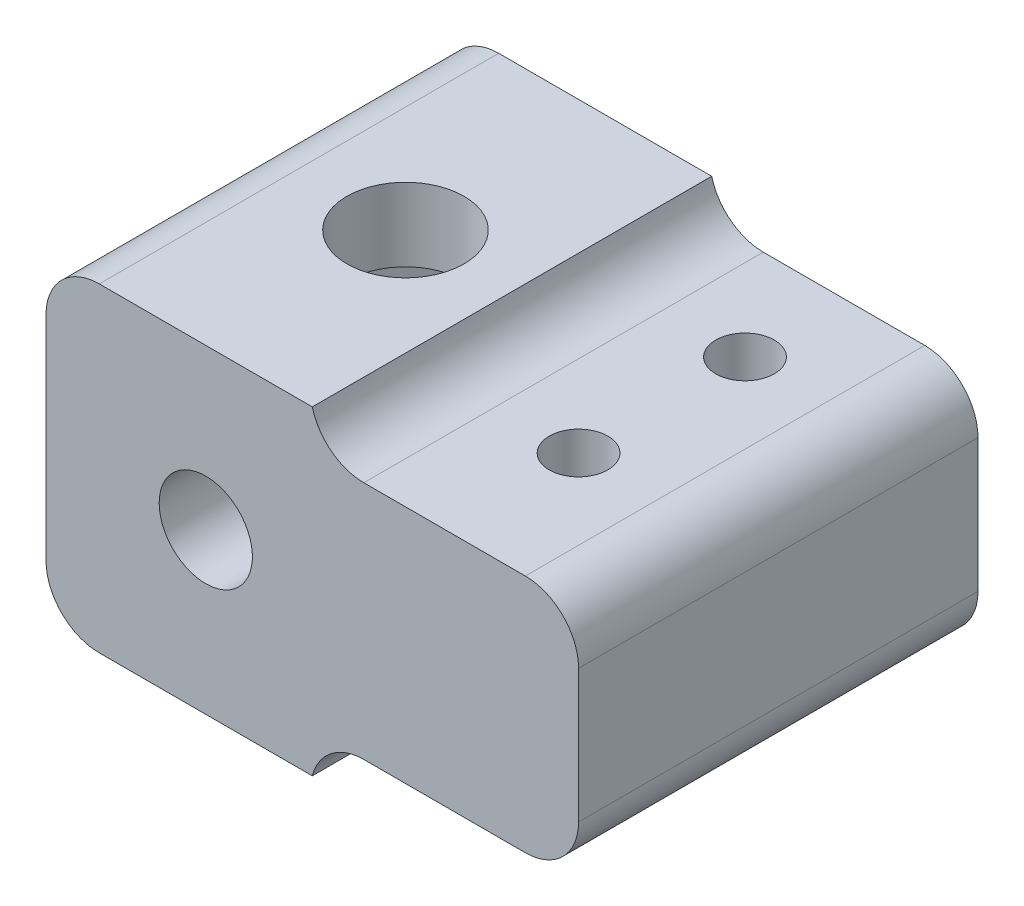
ISO-10303-21;
HEADER;
FILE_DESCRIPTION(('STEP AP214'),'2;1');
FILE_NAME('part.step','',(''),(''),'','','');
FILE_SCHEMA(('AUTOMOTIVE_DESIGN { 1 0 10303 214 1 1 1 1 }'));
ENDSEC;
DATA;
#1=APPLICATION_CONTEXT('core data for automotive mechanical design processes');
#2=APPLICATION_PROTOCOL_DEFINITION('international standard','automotive_design',2000,#1);
#3=PRODUCT_CONTEXT('',#1,'mechanical');
#4=PRODUCT('Part','Part','',(#3));
#5=PRODUCT_RELATED_PRODUCT_CATEGORY('part','',(#4));
#6=PRODUCT_DEFINITION_FORMATION('','',#4);
#7=PRODUCT_DEFINITION_CONTEXT('part definition',#1,'design');
#8=PRODUCT_DEFINITION('design','',#6,#7);
#9=PRODUCT_DEFINITION_SHAPE('','',#8);
#10=(LENGTH_UNIT() NAMED_UNIT(*) SI_UNIT(.MILLI.,.METRE.));
#11=(NAMED_UNIT(*) PLANE_ANGLE_UNIT() SI_UNIT($,.RADIAN.));
#12=(NAMED_UNIT(*) SI_UNIT($,.STERADIAN.) SOLID_ANGLE_UNIT());
#13=UNCERTAINTY_MEASURE_WITH_UNIT(LENGTH_MEASURE(1.E-05),#10,'distance_accuracy_value','');
#14=(GEOMETRIC_REPRESENTATION_CONTEXT(3) GLOBAL_UNCERTAINTY_ASSIGNED_CONTEXT((#13)) GLOBAL_UNIT_ASSIGNED_CONTEXT((#10,
#11,#12)) REPRESENTATION_CONTEXT('',''));
#15=CARTESIAN_POINT('',(0.,0.,0.));
#16=DIRECTION('',(0.,0.,1.));
#17=DIRECTION('',(1.,0.,0.));
#18=AXIS2_PLACEMENT_3D('',#15,#16,#17);
#19=CARTESIAN_POINT('',(-6.,6.,-15.));
#20=DIRECTION('',(0.,-1.,0.));
#21=DIRECTION('',(0.,0.,-1.));
#22=AXIS2_PLACEMENT_3D('',#19,#20,#21);
#23=PLANE('',#22);
#24=CARTESIAN_POINT('',(0.,6.,-7.5));
#25=DIRECTION('',(0.,-1.,0.));
#26=DIRECTION('',(0.,0.,-1.));
#27=AXIS2_PLACEMENT_3D('',#24,#25,#26);
#28=CIRCLE('',#27,2.2);
#29=CARTESIAN_POINT('',(0.,6.,-9.7));
#30=VERTEX_POINT('',#29);
#31=EDGE_CURVE('E181',#30,#30,#28,.T.);
#32=ORIENTED_EDGE('',*,*,#31,.T.);
#33=EDGE_LOOP('',(#32));
#34=FACE_BOUND('',#33,.T.);
#35=DIRECTION('',(0.,0.,-1.));
#36=VECTOR('',#35,1.);
#37=CARTESIAN_POINT('',(4.,6.,-15.));
#38=LINE('',#37,#36);
#39=CARTESIAN_POINT('',(4.,6.,0.));
#40=VERTEX_POINT('',#39);
#41=CARTESIAN_POINT('',(4.,6.,-15.));
#42=VERTEX_POINT('',#41);
#43=EDGE_CURVE('E184',#40,#42,#38,.T.);
#44=ORIENTED_EDGE('',*,*,#43,.T.);
#45=DIRECTION('',(1.,0.,0.));
#46=VECTOR('',#45,1.);
#47=CARTESIAN_POINT('',(-6.,6.,-15.));
#48=LINE('',#47,#46);
#49=CARTESIAN_POINT('',(-4.,6.,-15.));
#50=VERTEX_POINT('',#49);
#51=EDGE_CURVE('E232',#50,#42,#48,.T.);
#52=ORIENTED_EDGE('',*,*,#51,.F.);
#53=DIRECTION('',(0.,0.,1.));
#54=VECTOR('',#53,1.);
#55=CARTESIAN_POINT('',(-4.,6.,-15.));
#56=LINE('',#55,#54);
#57=CARTESIAN_POINT('',(-4.,6.,0.));
#58=VERTEX_POINT('',#57);
#59=EDGE_CURVE('E235',#50,#58,#56,.T.);
#60=ORIENTED_EDGE('',*,*,#59,.T.);
#61=DIRECTION('',(1.,0.,0.));
#62=VECTOR('',#61,1.);
#63=CARTESIAN_POINT('',(-6.,6.,0.));
#64=LINE('',#63,#62);
#65=EDGE_CURVE('E229',#58,#40,#64,.T.);
#66=ORIENTED_EDGE('',*,*,#65,.T.);
#67=EDGE_LOOP('',(#44,#52,#60,#66));
#68=FACE_BOUND('',#67,.T.);
#69=ADVANCED_FACE('F36',(#34,#68),#23,.F.);
#70=CARTESIAN_POINT('',(0.,0.,-15.));
#71=DIRECTION('',(0.,0.,-1.));
#72=DIRECTION('',(-1.,0.,0.));
#73=AXIS2_PLACEMENT_3D('',#70,#71,#72);
#74=PLANE('',#73);
#75=DIRECTION('',(0.,1.,0.));
#76=VECTOR('',#75,1.);
#77=CARTESIAN_POINT('',(14.,-6.,-15.));
#78=LINE('',#77,#76);
#79=CARTESIAN_POINT('',(14.,-2.5,-15.));
#80=VERTEX_POINT('',#79);
#81=CARTESIAN_POINT('',(14.,2.5,-15.));
#82=VERTEX_POINT('',#81);
#83=EDGE_CURVE('E210',#80,#82,#78,.T.);
#84=ORIENTED_EDGE('',*,*,#83,.F.);
#85=CARTESIAN_POINT('',(12.,-2.5,-15.));
#86=DIRECTION('',(0.,0.,-1.));
#87=DIRECTION('',(-1.,0.,0.));
#88=AXIS2_PLACEMENT_3D('',#85,#86,#87);
#89=CIRCLE('',#88,2.);
#90=CARTESIAN_POINT('',(12.,-4.5,-15.));
#91=VERTEX_POINT('',#90);
#92=EDGE_CURVE('E286',#80,#91,#89,.T.);
#93=ORIENTED_EDGE('',*,*,#92,.T.);
#94=DIRECTION('',(1.,0.,0.));
#95=VECTOR('',#94,1.);
#96=CARTESIAN_POINT('',(14.,-4.5,-15.));
#97=LINE('',#96,#95);
#98=CARTESIAN_POINT('',(5.93649167310371,-4.5,-15.));
#99=VERTEX_POINT('',#98);
#100=EDGE_CURVE('E201',#99,#91,#97,.T.);
#101=ORIENTED_EDGE('',*,*,#100,.F.);
#102=CARTESIAN_POINT('',(5.93649167310371,-6.5,-15.));
#103=DIRECTION('',(0.,0.,-1.));
#104=DIRECTION('',(-1.,0.,0.));
#105=AXIS2_PLACEMENT_3D('',#102,#103,#104);
#106=CIRCLE('',#105,2.);
#107=CARTESIAN_POINT('',(4.,-6.,-15.));
#108=VERTEX_POINT('',#107);
#109=EDGE_CURVE('E45',#99,#108,#106,.F.);
#110=ORIENTED_EDGE('',*,*,#109,.T.);
#111=DIRECTION('',(-1.,0.,0.));
#112=VECTOR('',#111,1.);
#113=CARTESIAN_POINT('',(-6.,-6.,-15.));
#114=LINE('',#113,#112);
#115=CARTESIAN_POINT('',(-4.,-6.,-15.));
#116=VERTEX_POINT('',#115);
#117=EDGE_CURVE('E226',#108,#116,#114,.T.);
#118=ORIENTED_EDGE('',*,*,#117,.T.);
#119=CARTESIAN_POINT('',(-4.,-4.,-15.));
#120=DIRECTION('',(0.,0.,-1.));
#121=DIRECTION('',(-1.,0.,0.));
#122=AXIS2_PLACEMENT_3D('',#119,#120,#121);
#123=CIRCLE('',#122,2.);
#124=CARTESIAN_POINT('',(-6.,-4.,-15.));
#125=VERTEX_POINT('',#124);
#126=EDGE_CURVE('E254',#116,#125,#123,.T.);
#127=ORIENTED_EDGE('',*,*,#126,.T.);
#128=DIRECTION('',(0.,1.,0.));
#129=VECTOR('',#128,1.);
#130=CARTESIAN_POINT('',(-6.,-6.,-15.));
#131=LINE('',#130,#129);
#132=CARTESIAN_POINT('',(-6.,4.,-15.));
#133=VERTEX_POINT('',#132);
#134=EDGE_CURVE('E228',#125,#133,#131,.T.);
#135=ORIENTED_EDGE('',*,*,#134,.T.);
#136=CARTESIAN_POINT('',(-4.,4.,-15.));
#137=DIRECTION('',(0.,0.,-1.));
#138=DIRECTION('',(-1.,0.,0.));
#139=AXIS2_PLACEMENT_3D('',#136,#137,#138);
#140=CIRCLE('',#139,2.);
#141=EDGE_CURVE('E256',#133,#50,#140,.T.);
#142=ORIENTED_EDGE('',*,*,#141,.T.);
#143=ORIENTED_EDGE('',*,*,#51,.T.);
#144=CARTESIAN_POINT('',(5.93649167310371,6.5,-15.));
#145=DIRECTION('',(0.,0.,-1.));
#146=DIRECTION('',(-1.,0.,0.));
#147=AXIS2_PLACEMENT_3D('',#144,#145,#146);
#148=CIRCLE('',#147,2.);
#149=CARTESIAN_POINT('',(5.93649167310371,4.5,-15.));
#150=VERTEX_POINT('',#149);
#151=EDGE_CURVE('E288',#42,#150,#148,.F.);
#152=ORIENTED_EDGE('',*,*,#151,.T.);
#153=DIRECTION('',(1.,0.,0.));
#154=VECTOR('',#153,1.);
#155=CARTESIAN_POINT('',(-6.,4.5,-15.));
#156=LINE('',#155,#154);
#157=CARTESIAN_POINT('',(12.,4.5,-15.));
#158=VERTEX_POINT('',#157);
#159=EDGE_CURVE('E188',#150,#158,#156,.T.);
#160=ORIENTED_EDGE('',*,*,#159,.T.);
#161=CARTESIAN_POINT('',(12.,2.5,-15.));
#162=DIRECTION('',(0.,0.,-1.));
#163=DIRECTION('',(-1.,0.,0.));
#164=AXIS2_PLACEMENT_3D('',#161,#162,#163);
#165=CIRCLE('',#164,2.);
#166=EDGE_CURVE('E284',#158,#82,#165,.T.);
#167=ORIENTED_EDGE('',*,*,#166,.T.);
#168=EDGE_LOOP('',(#84,#93,#101,#110,#118,#127,#135,#142,#143,#152,#160,#167));
#169=FACE_BOUND('',#168,.T.);
#170=DIRECTION('',(-1.,0.,0.));
#171=VECTOR('',#170,1.);
#172=CARTESIAN_POINT('',(-3.25,-3.25,-15.));
#173=LINE('',#172,#171);
#174=CARTESIAN_POINT('',(3.25,-3.25,-15.));
#175=VERTEX_POINT('',#174);
#176=CARTESIAN_POINT('',(-3.25,-3.25,-15.));
#177=VERTEX_POINT('',#176);
#178=EDGE_CURVE('E215',#175,#177,#173,.T.);
#179=ORIENTED_EDGE('',*,*,#178,.F.);
#180=DIRECTION('',(0.,-1.,0.));
#181=VECTOR('',#180,1.);
#182=CARTESIAN_POINT('',(3.25,-3.25,-15.));
#183=LINE('',#182,#181);
#184=CARTESIAN_POINT('',(3.25,3.25,-15.));
#185=VERTEX_POINT('',#184);
#186=EDGE_CURVE('E213',#185,#175,#183,.T.);
#187=ORIENTED_EDGE('',*,*,#186,.F.);
#188=DIRECTION('',(1.,0.,0.));
#189=VECTOR('',#188,1.);
#190=CARTESIAN_POINT('',(-3.25,3.25,-15.));
#191=LINE('',#190,#189);
#192=CARTESIAN_POINT('',(-3.25,3.25,-15.));
#193=VERTEX_POINT('',#192);
#194=EDGE_CURVE('E157',#193,#185,#191,.T.);
#195=ORIENTED_EDGE('',*,*,#194,.F.);
#196=DIRECTION('',(0.,1.,0.));
#197=VECTOR('',#196,1.);
#198=CARTESIAN_POINT('',(-3.25,-3.25,-15.));
#199=LINE('',#198,#197);
#200=EDGE_CURVE('E217',#177,#193,#199,.T.);
#201=ORIENTED_EDGE('',*,*,#200,.F.);
#202=EDGE_LOOP('',(#179,#187,#195,#201));
#203=FACE_BOUND('',#202,.T.);
#204=ADVANCED_FACE('F296',(#169,#203),#74,.T.);
#205=CARTESIAN_POINT('',(0.,0.,0.));
#206=DIRECTION('',(0.,0.,-1.));
#207=DIRECTION('',(-1.,0.,0.));
#208=AXIS2_PLACEMENT_3D('',#205,#206,#207);
#209=PLANE('',#208);
#210=DIRECTION('',(-1.,0.,0.));
#211=VECTOR('',#210,1.);
#212=CARTESIAN_POINT('',(14.,-4.5,0.));
#213=LINE('',#212,#211);
#214=CARTESIAN_POINT('',(12.,-4.5,0.));
#215=VERTEX_POINT('',#214);
#216=CARTESIAN_POINT('',(5.93649167310371,-4.5,0.));
#217=VERTEX_POINT('',#216);
#218=EDGE_CURVE('E198',#215,#217,#213,.T.);
#219=ORIENTED_EDGE('',*,*,#218,.F.);
#220=CARTESIAN_POINT('',(12.,-2.5,0.));
#221=DIRECTION('',(0.,0.,-1.));
#222=DIRECTION('',(-1.,0.,0.));
#223=AXIS2_PLACEMENT_3D('',#220,#221,#222);
#224=CIRCLE('',#223,2.);
#225=CARTESIAN_POINT('',(14.,-2.5,0.));
#226=VERTEX_POINT('',#225);
#227=EDGE_CURVE('E277',#215,#226,#224,.F.);
#228=ORIENTED_EDGE('',*,*,#227,.T.);
#229=DIRECTION('',(0.,-1.,0.));
#230=VECTOR('',#229,1.);
#231=CARTESIAN_POINT('',(14.,6.,0.));
#232=LINE('',#231,#230);
#233=CARTESIAN_POINT('',(14.,2.5,0.));
#234=VERTEX_POINT('',#233);
#235=EDGE_CURVE('E207',#234,#226,#232,.T.);
#236=ORIENTED_EDGE('',*,*,#235,.F.);
#237=CARTESIAN_POINT('',(12.,2.5,0.));
#238=DIRECTION('',(0.,0.,-1.));
#239=DIRECTION('',(-1.,0.,0.));
#240=AXIS2_PLACEMENT_3D('',#237,#238,#239);
#241=CIRCLE('',#240,2.);
#242=CARTESIAN_POINT('',(12.,4.5,0.));
#243=VERTEX_POINT('',#242);
#244=EDGE_CURVE('E275',#234,#243,#241,.F.);
#245=ORIENTED_EDGE('',*,*,#244,.T.);
#246=DIRECTION('',(-1.,0.,0.));
#247=VECTOR('',#246,1.);
#248=CARTESIAN_POINT('',(-6.,4.5,0.));
#249=LINE('',#248,#247);
#250=CARTESIAN_POINT('',(5.93649167310371,4.5,0.));
#251=VERTEX_POINT('',#250);
#252=EDGE_CURVE('E185',#243,#251,#249,.T.);
#253=ORIENTED_EDGE('',*,*,#252,.T.);
#254=CARTESIAN_POINT('',(5.93649167310371,6.5,0.));
#255=DIRECTION('',(0.,0.,-1.));
#256=DIRECTION('',(-1.,0.,0.));
#257=AXIS2_PLACEMENT_3D('',#254,#255,#256);
#258=CIRCLE('',#257,2.);
#259=EDGE_CURVE('E290',#251,#40,#258,.T.);
#260=ORIENTED_EDGE('',*,*,#259,.T.);
#261=ORIENTED_EDGE('',*,*,#65,.F.);
#262=CARTESIAN_POINT('',(-4.,4.,0.));
#263=DIRECTION('',(0.,0.,-1.));
#264=DIRECTION('',(-1.,0.,0.));
#265=AXIS2_PLACEMENT_3D('',#262,#263,#264);
#266=CIRCLE('',#265,2.);
#267=CARTESIAN_POINT('',(-6.,4.,0.));
#268=VERTEX_POINT('',#267);
#269=EDGE_CURVE('E247',#58,#268,#266,.F.);
#270=ORIENTED_EDGE('',*,*,#269,.T.);
#271=DIRECTION('',(0.,1.,0.));
#272=VECTOR('',#271,1.);
#273=CARTESIAN_POINT('',(-6.,-6.,0.));
#274=LINE('',#273,#272);
#275=CARTESIAN_POINT('',(-6.,-4.,0.));
#276=VERTEX_POINT('',#275);
#277=EDGE_CURVE('E237',#276,#268,#274,.T.);
#278=ORIENTED_EDGE('',*,*,#277,.F.);
#279=CARTESIAN_POINT('',(-4.,-4.,0.));
#280=DIRECTION('',(0.,0.,-1.));
#281=DIRECTION('',(-1.,0.,0.));
#282=AXIS2_PLACEMENT_3D('',#279,#280,#281);
#283=CIRCLE('',#282,2.);
#284=CARTESIAN_POINT('',(-4.,-6.,0.));
#285=VERTEX_POINT('',#284);
#286=EDGE_CURVE('E244',#276,#285,#283,.F.);
#287=ORIENTED_EDGE('',*,*,#286,.T.);
#288=DIRECTION('',(-1.,0.,0.));
#289=VECTOR('',#288,1.);
#290=CARTESIAN_POINT('',(-6.,-6.,0.));
#291=LINE('',#290,#289);
#292=CARTESIAN_POINT('',(4.,-6.,0.));
#293=VERTEX_POINT('',#292);
#294=EDGE_CURVE('E225',#293,#285,#291,.T.);
#295=ORIENTED_EDGE('',*,*,#294,.F.);
#296=CARTESIAN_POINT('',(5.93649167310371,-6.5,0.));
#297=DIRECTION('',(0.,0.,-1.));
#298=DIRECTION('',(-1.,0.,0.));
#299=AXIS2_PLACEMENT_3D('',#296,#297,#298);
#300=CIRCLE('',#299,2.);
#301=EDGE_CURVE('E11',#293,#217,#300,.T.);
#302=ORIENTED_EDGE('',*,*,#301,.T.);
#303=EDGE_LOOP('',(#219,#228,#236,#245,#253,#260,#261,#270,#278,#287,#295,#302));
#304=FACE_BOUND('',#303,.T.);
#305=CARTESIAN_POINT('',(0.,0.,0.));
#306=DIRECTION('',(0.,0.,-1.));
#307=DIRECTION('',(-1.,0.,0.));
#308=AXIS2_PLACEMENT_3D('',#305,#306,#307);
#309=CIRCLE('',#308,1.75);
#310=CARTESIAN_POINT('',(-1.75,0.,0.));
#311=VERTEX_POINT('',#310);
#312=EDGE_CURVE('E167',#311,#311,#309,.F.);
#313=ORIENTED_EDGE('',*,*,#312,.F.);
#314=EDGE_LOOP('',(#313));
#315=FACE_BOUND('',#314,.T.);
#316=ADVANCED_FACE('F309',(#304,#315),#209,.F.);
#317=CARTESIAN_POINT('',(-6.,-6.,-15.));
#318=DIRECTION('',(0.,1.,0.));
#319=DIRECTION('',(0.,0.,1.));
#320=AXIS2_PLACEMENT_3D('',#317,#318,#319);
#321=PLANE('',#320);
#322=CARTESIAN_POINT('',(0.,-6.,-7.5));
#323=DIRECTION('',(0.,-1.,0.));
#324=DIRECTION('',(0.,0.,-1.));
#325=AXIS2_PLACEMENT_3D('',#322,#323,#324);
#326=CIRCLE('',#325,2.2);
#327=CARTESIAN_POINT('',(0.,-6.,-9.7));
#328=VERTEX_POINT('',#327);
#329=EDGE_CURVE('E380',#328,#328,#326,.T.);
#330=ORIENTED_EDGE('',*,*,#329,.F.);
#331=EDGE_LOOP('',(#330));
#332=FACE_BOUND('',#331,.T.);
#333=ORIENTED_EDGE('',*,*,#117,.F.);
#334=DIRECTION('',(0.,0.,-1.));
#335=VECTOR('',#334,1.);
#336=CARTESIAN_POINT('',(4.,-6.,0.));
#337=LINE('',#336,#335);
#338=EDGE_CURVE('E197',#293,#108,#337,.T.);
#339=ORIENTED_EDGE('',*,*,#338,.F.);
#340=ORIENTED_EDGE('',*,*,#294,.T.);
#341=DIRECTION('',(0.,0.,1.));
#342=VECTOR('',#341,1.);
#343=CARTESIAN_POINT('',(-4.,-6.,-15.));
#344=LINE('',#343,#342);
#345=EDGE_CURVE('E258',#285,#116,#344,.F.);
#346=ORIENTED_EDGE('',*,*,#345,.T.);
#347=EDGE_LOOP('',(#333,#339,#340,#346));
#348=FACE_BOUND('',#347,.T.);
#349=ADVANCED_FACE('F301',(#332,#348),#321,.F.);
#350=CARTESIAN_POINT('',(-6.,-6.,-15.));
#351=DIRECTION('',(1.,0.,0.));
#352=DIRECTION('',(0.,0.,-1.));
#353=AXIS2_PLACEMENT_3D('',#350,#351,#352);
#354=PLANE('',#353);
#355=ORIENTED_EDGE('',*,*,#277,.T.);
#356=DIRECTION('',(0.,0.,1.));
#357=VECTOR('',#356,1.);
#358=CARTESIAN_POINT('',(-6.,4.,-15.));
#359=LINE('',#358,#357);
#360=EDGE_CURVE('E252',#268,#133,#359,.F.);
#361=ORIENTED_EDGE('',*,*,#360,.T.);
#362=ORIENTED_EDGE('',*,*,#134,.F.);
#363=DIRECTION('',(0.,0.,1.));
#364=VECTOR('',#363,1.);
#365=CARTESIAN_POINT('',(-6.,-4.,-15.));
#366=LINE('',#365,#364);
#367=EDGE_CURVE('E249',#125,#276,#366,.T.);
#368=ORIENTED_EDGE('',*,*,#367,.T.);
#369=EDGE_LOOP('',(#355,#361,#362,#368));
#370=FACE_BOUND('',#369,.T.);
#371=ADVANCED_FACE('F346',(#370),#354,.F.);
#372=CARTESIAN_POINT('',(3.25,-3.25,-15.));
#373=DIRECTION('',(-1.,0.,0.));
#374=DIRECTION('',(0.,0.,1.));
#375=AXIS2_PLACEMENT_3D('',#372,#373,#374);
#376=PLANE('',#375);
#377=DIRECTION('',(0.,1.,0.));
#378=VECTOR('',#377,1.);
#379=CARTESIAN_POINT('',(3.25,0.,-3.));
#380=LINE('',#379,#378);
#381=CARTESIAN_POINT('',(3.25,-3.25,-3.));
#382=VERTEX_POINT('',#381);
#383=CARTESIAN_POINT('',(3.25,3.25,-3.));
#384=VERTEX_POINT('',#383);
#385=EDGE_CURVE('E163',#382,#384,#380,.T.);
#386=ORIENTED_EDGE('',*,*,#385,.T.);
#387=DIRECTION('',(0.,0.,1.));
#388=VECTOR('',#387,1.);
#389=CARTESIAN_POINT('',(3.25,3.25,-15.));
#390=LINE('',#389,#388);
#391=EDGE_CURVE('E151',#185,#384,#390,.T.);
#392=ORIENTED_EDGE('',*,*,#391,.F.);
#393=ORIENTED_EDGE('',*,*,#186,.T.);
#394=DIRECTION('',(0.,0.,1.));
#395=VECTOR('',#394,1.);
#396=CARTESIAN_POINT('',(3.25,-3.25,-15.));
#397=LINE('',#396,#395);
#398=EDGE_CURVE('E165',#175,#382,#397,.T.);
#399=ORIENTED_EDGE('',*,*,#398,.T.);
#400=EDGE_LOOP('',(#386,#392,#393,#399));
#401=FACE_BOUND('',#400,.T.);
#402=ADVANCED_FACE('F164',(#401),#376,.T.);
#403=CARTESIAN_POINT('',(-3.25,-3.25,-15.));
#404=DIRECTION('',(0.,1.,0.));
#405=DIRECTION('',(0.,0.,1.));
#406=AXIS2_PLACEMENT_3D('',#403,#404,#405);
#407=PLANE('',#406);
#408=CARTESIAN_POINT('',(0.,-3.25,-7.5));
#409=DIRECTION('',(0.,1.,0.));
#410=DIRECTION('',(0.,0.,1.));
#411=AXIS2_PLACEMENT_3D('',#408,#409,#410);
#412=CIRCLE('',#411,2.2);
#413=CARTESIAN_POINT('',(0.,-3.25,-5.3));
#414=VERTEX_POINT('',#413);
#415=EDGE_CURVE('E384',#414,#414,#412,.T.);
#416=ORIENTED_EDGE('',*,*,#415,.F.);
#417=EDGE_LOOP('',(#416));
#418=FACE_BOUND('',#417,.T.);
#419=DIRECTION('',(1.,0.,0.));
#420=VECTOR('',#419,1.);
#421=CARTESIAN_POINT('',(0.,-3.25,-3.));
#422=LINE('',#421,#420);
#423=CARTESIAN_POINT('',(-3.25,-3.25,-3.));
#424=VERTEX_POINT('',#423);
#425=EDGE_CURVE('E52',#424,#382,#422,.T.);
#426=ORIENTED_EDGE('',*,*,#425,.T.);
#427=ORIENTED_EDGE('',*,*,#398,.F.);
#428=ORIENTED_EDGE('',*,*,#178,.T.);
#429=DIRECTION('',(0.,0.,1.));
#430=VECTOR('',#429,1.);
#431=CARTESIAN_POINT('',(-3.25,-3.25,-15.));
#432=LINE('',#431,#430);
#433=EDGE_CURVE('E222',#177,#424,#432,.T.);
#434=ORIENTED_EDGE('',*,*,#433,.T.);
#435=EDGE_LOOP('',(#426,#427,#428,#434));
#436=FACE_BOUND('',#435,.T.);
#437=ADVANCED_FACE('F424',(#418,#436),#407,.T.);
#438=CARTESIAN_POINT('',(-3.25,-3.25,-15.));
#439=DIRECTION('',(1.,0.,0.));
#440=DIRECTION('',(0.,0.,-1.));
#441=AXIS2_PLACEMENT_3D('',#438,#439,#440);
#442=PLANE('',#441);
#443=DIRECTION('',(0.,1.,0.));
#444=VECTOR('',#443,1.);
#445=CARTESIAN_POINT('',(-3.25,0.,-3.));
#446=LINE('',#445,#444);
#447=CARTESIAN_POINT('',(-3.25,3.25,-3.));
#448=VERTEX_POINT('',#447);
#449=EDGE_CURVE('E60',#424,#448,#446,.T.);
#450=ORIENTED_EDGE('',*,*,#449,.F.);
#451=ORIENTED_EDGE('',*,*,#433,.F.);
#452=ORIENTED_EDGE('',*,*,#200,.T.);
#453=DIRECTION('',(0.,0.,1.));
#454=VECTOR('',#453,1.);
#455=CARTESIAN_POINT('',(-3.25,3.25,-15.));
#456=LINE('',#455,#454);
#457=EDGE_CURVE('E160',#193,#448,#456,.T.);
#458=ORIENTED_EDGE('',*,*,#457,.T.);
#459=EDGE_LOOP('',(#450,#451,#452,#458));
#460=FACE_BOUND('',#459,.T.);
#461=ADVANCED_FACE('F420',(#460),#442,.T.);
#462=CARTESIAN_POINT('',(-3.25,3.25,-15.));
#463=DIRECTION('',(0.,-1.,0.));
#464=DIRECTION('',(0.,0.,-1.));
#465=AXIS2_PLACEMENT_3D('',#462,#463,#464);
#466=PLANE('',#465);
#467=CARTESIAN_POINT('',(0.,3.25,-7.5));
#468=DIRECTION('',(0.,-1.,0.));
#469=DIRECTION('',(0.,0.,-1.));
#470=AXIS2_PLACEMENT_3D('',#467,#468,#469);
#471=CIRCLE('',#470,2.2);
#472=CARTESIAN_POINT('',(0.,3.25,-9.7));
#473=VERTEX_POINT('',#472);
#474=EDGE_CURVE('E40',#473,#473,#471,.T.);
#475=ORIENTED_EDGE('',*,*,#474,.F.);
#476=EDGE_LOOP('',(#475));
#477=FACE_BOUND('',#476,.T.);
#478=DIRECTION('',(1.,0.,0.));
#479=VECTOR('',#478,1.);
#480=CARTESIAN_POINT('',(0.,3.25,-3.));
#481=LINE('',#480,#479);
#482=EDGE_CURVE('E155',#448,#384,#481,.T.);
#483=ORIENTED_EDGE('',*,*,#482,.F.);
#484=ORIENTED_EDGE('',*,*,#457,.F.);
#485=ORIENTED_EDGE('',*,*,#194,.T.);
#486=ORIENTED_EDGE('',*,*,#391,.T.);
#487=EDGE_LOOP('',(#483,#484,#485,#486));
#488=FACE_BOUND('',#487,.T.);
#489=ADVANCED_FACE('F153',(#477,#488),#466,.T.);
#490=CARTESIAN_POINT('',(14.,0.,0.));
#491=DIRECTION('',(1.,0.,0.));
#492=DIRECTION('',(0.,0.,-1.));
#493=AXIS2_PLACEMENT_3D('',#490,#491,#492);
#494=PLANE('',#493);
#495=ORIENTED_EDGE('',*,*,#235,.T.);
#496=DIRECTION('',(0.,0.,1.));
#497=VECTOR('',#496,1.);
#498=CARTESIAN_POINT('',(14.,-2.5,-15.));
#499=LINE('',#498,#497);
#500=EDGE_CURVE('E282',#226,#80,#499,.F.);
#501=ORIENTED_EDGE('',*,*,#500,.T.);
#502=ORIENTED_EDGE('',*,*,#83,.T.);
#503=DIRECTION('',(0.,0.,1.));
#504=VECTOR('',#503,1.);
#505=CARTESIAN_POINT('',(14.,2.5,0.));
#506=LINE('',#505,#504);
#507=EDGE_CURVE('E279',#82,#234,#506,.T.);
#508=ORIENTED_EDGE('',*,*,#507,.T.);
#509=EDGE_LOOP('',(#495,#501,#502,#508));
#510=FACE_BOUND('',#509,.T.);
#511=ADVANCED_FACE('F321',(#510),#494,.T.);
#512=CARTESIAN_POINT('',(9.,-6.,-5.));
#513=DIRECTION('',(0.,1.,0.));
#514=DIRECTION('',(0.,0.,1.));
#515=AXIS2_PLACEMENT_3D('',#512,#513,#514);
#516=CYLINDRICAL_SURFACE('',#515,1.1);
#517=CARTESIAN_POINT('',(9.,4.5,-5.));
#518=DIRECTION('',(0.,-1.,0.));
#519=DIRECTION('',(0.,0.,-1.));
#520=AXIS2_PLACEMENT_3D('',#517,#518,#519);
#521=CIRCLE('',#520,1.1);
#522=CARTESIAN_POINT('',(9.,4.5,-6.1));
#523=VERTEX_POINT('',#522);
#524=EDGE_CURVE('E174',#523,#523,#521,.T.);
#525=ORIENTED_EDGE('',*,*,#524,.F.);
#526=EDGE_LOOP('',(#525));
#527=FACE_BOUND('',#526,.T.);
#528=CARTESIAN_POINT('',(9.,-4.5,-5.));
#529=DIRECTION('',(0.,-1.,0.));
#530=DIRECTION('',(0.,0.,-1.));
#531=AXIS2_PLACEMENT_3D('',#528,#529,#530);
#532=CIRCLE('',#531,1.1);
#533=CARTESIAN_POINT('',(9.,-4.5,-6.1));
#534=VERTEX_POINT('',#533);
#535=EDGE_CURVE('E194',#534,#534,#532,.T.);
#536=ORIENTED_EDGE('',*,*,#535,.T.);
#537=EDGE_LOOP('',(#536));
#538=FACE_BOUND('',#537,.T.);
#539=ADVANCED_FACE('F411',(#527,#538),#516,.F.);
#540=CARTESIAN_POINT('',(9.,-6.,-11.25));
#541=DIRECTION('',(0.,1.,0.));
#542=DIRECTION('',(0.,0.,1.));
#543=AXIS2_PLACEMENT_3D('',#540,#541,#542);
#544=CYLINDRICAL_SURFACE('',#543,1.1);
#545=CARTESIAN_POINT('',(9.,4.5,-11.25));
#546=DIRECTION('',(0.,-1.,0.));
#547=DIRECTION('',(0.,0.,-1.));
#548=AXIS2_PLACEMENT_3D('',#545,#546,#547);
#549=CIRCLE('',#548,1.1);
#550=CARTESIAN_POINT('',(9.,4.5,-12.35));
#551=VERTEX_POINT('',#550);
#552=EDGE_CURVE('E191',#551,#551,#549,.F.);
#553=ORIENTED_EDGE('',*,*,#552,.T.);
#554=EDGE_LOOP('',(#553));
#555=FACE_BOUND('',#554,.T.);
#556=CARTESIAN_POINT('',(9.,-4.5,-11.25));
#557=DIRECTION('',(0.,1.,0.));
#558=DIRECTION('',(0.,0.,1.));
#559=AXIS2_PLACEMENT_3D('',#556,#557,#558);
#560=CIRCLE('',#559,1.1);
#561=CARTESIAN_POINT('',(9.,-4.5,-10.15));
#562=VERTEX_POINT('',#561);
#563=EDGE_CURVE('E204',#562,#562,#560,.F.);
#564=ORIENTED_EDGE('',*,*,#563,.T.);
#565=EDGE_LOOP('',(#564));
#566=FACE_BOUND('',#565,.T.);
#567=ADVANCED_FACE('F358',(#555,#566),#544,.F.);
#568=CARTESIAN_POINT('',(-4.,4.,-15.));
#569=DIRECTION('',(0.,0.,1.));
#570=DIRECTION('',(1.,0.,0.));
#571=AXIS2_PLACEMENT_3D('',#568,#569,#570);
#572=CYLINDRICAL_SURFACE('',#571,2.);
#573=ORIENTED_EDGE('',*,*,#141,.F.);
#574=ORIENTED_EDGE('',*,*,#360,.F.);
#575=ORIENTED_EDGE('',*,*,#269,.F.);
#576=ORIENTED_EDGE('',*,*,#59,.F.);
#577=EDGE_LOOP('',(#573,#574,#575,#576));
#578=FACE_BOUND('',#577,.T.);
#579=ADVANCED_FACE('F342',(#578),#572,.T.);
#580=CARTESIAN_POINT('',(-4.,-4.,-15.));
#581=DIRECTION('',(0.,0.,1.));
#582=DIRECTION('',(1.,0.,0.));
#583=AXIS2_PLACEMENT_3D('',#580,#581,#582);
#584=CYLINDRICAL_SURFACE('',#583,2.);
#585=ORIENTED_EDGE('',*,*,#126,.F.);
#586=ORIENTED_EDGE('',*,*,#345,.F.);
#587=ORIENTED_EDGE('',*,*,#286,.F.);
#588=ORIENTED_EDGE('',*,*,#367,.F.);
#589=EDGE_LOOP('',(#585,#586,#587,#588));
#590=FACE_BOUND('',#589,.T.);
#591=ADVANCED_FACE('F350',(#590),#584,.T.);
#592=CARTESIAN_POINT('',(0.,-4.5,0.));
#593=DIRECTION('',(0.,1.,0.));
#594=DIRECTION('',(0.,0.,1.));
#595=AXIS2_PLACEMENT_3D('',#592,#593,#594);
#596=PLANE('',#595);
#597=ORIENTED_EDGE('',*,*,#218,.T.);
#598=DIRECTION('',(0.,0.,-1.));
#599=VECTOR('',#598,1.);
#600=CARTESIAN_POINT('',(5.93649167310371,-4.5,0.));
#601=LINE('',#600,#599);
#602=EDGE_CURVE('E272',#217,#99,#601,.T.);
#603=ORIENTED_EDGE('',*,*,#602,.T.);
#604=ORIENTED_EDGE('',*,*,#100,.T.);
#605=DIRECTION('',(0.,0.,1.));
#606=VECTOR('',#605,1.);
#607=CARTESIAN_POINT('',(12.,-4.5,0.));
#608=LINE('',#607,#606);
#609=EDGE_CURVE('E269',#91,#215,#608,.T.);
#610=ORIENTED_EDGE('',*,*,#609,.T.);
#611=EDGE_LOOP('',(#597,#603,#604,#610));
#612=FACE_BOUND('',#611,.T.);
#613=ORIENTED_EDGE('',*,*,#535,.F.);
#614=EDGE_LOOP('',(#613));
#615=FACE_BOUND('',#614,.T.);
#616=ORIENTED_EDGE('',*,*,#563,.F.);
#617=EDGE_LOOP('',(#616));
#618=FACE_BOUND('',#617,.T.);
#619=ADVANCED_FACE('F312',(#612,#615,#618),#596,.F.);
#620=CARTESIAN_POINT('',(0.,4.5,0.));
#621=DIRECTION('',(0.,-1.,0.));
#622=DIRECTION('',(0.,0.,-1.));
#623=AXIS2_PLACEMENT_3D('',#620,#621,#622);
#624=PLANE('',#623);
#625=ORIENTED_EDGE('',*,*,#524,.T.);
#626=EDGE_LOOP('',(#625));
#627=FACE_BOUND('',#626,.T.);
#628=ORIENTED_EDGE('',*,*,#159,.F.);
#629=DIRECTION('',(0.,0.,-1.));
#630=VECTOR('',#629,1.);
#631=CARTESIAN_POINT('',(5.93649167310371,4.5,0.));
#632=LINE('',#631,#630);
#633=EDGE_CURVE('E267',#150,#251,#632,.F.);
#634=ORIENTED_EDGE('',*,*,#633,.T.);
#635=ORIENTED_EDGE('',*,*,#252,.F.);
#636=DIRECTION('',(0.,0.,1.));
#637=VECTOR('',#636,1.);
#638=CARTESIAN_POINT('',(12.,4.5,-15.));
#639=LINE('',#638,#637);
#640=EDGE_CURVE('E261',#243,#158,#639,.F.);
#641=ORIENTED_EDGE('',*,*,#640,.T.);
#642=EDGE_LOOP('',(#628,#634,#635,#641));
#643=FACE_BOUND('',#642,.T.);
#644=ORIENTED_EDGE('',*,*,#552,.F.);
#645=EDGE_LOOP('',(#644));
#646=FACE_BOUND('',#645,.T.);
#647=ADVANCED_FACE('F330',(#627,#643,#646),#624,.F.);
#648=CARTESIAN_POINT('',(5.93649167310371,6.5,-15.));
#649=DIRECTION('',(0.,0.,-1.));
#650=DIRECTION('',(-1.,0.,0.));
#651=AXIS2_PLACEMENT_3D('',#648,#649,#650);
#652=CYLINDRICAL_SURFACE('',#651,2.);
#653=ORIENTED_EDGE('',*,*,#259,.F.);
#654=ORIENTED_EDGE('',*,*,#633,.F.);
#655=ORIENTED_EDGE('',*,*,#151,.F.);
#656=ORIENTED_EDGE('',*,*,#43,.F.);
#657=EDGE_LOOP('',(#653,#654,#655,#656));
#658=FACE_BOUND('',#657,.T.);
#659=ADVANCED_FACE('F334',(#658),#652,.F.);
#660=CARTESIAN_POINT('',(5.93649167310371,-6.5,0.));
#661=DIRECTION('',(0.,0.,-1.));
#662=DIRECTION('',(-1.,0.,0.));
#663=AXIS2_PLACEMENT_3D('',#660,#661,#662);
#664=CYLINDRICAL_SURFACE('',#663,2.);
#665=ORIENTED_EDGE('',*,*,#301,.F.);
#666=ORIENTED_EDGE('',*,*,#338,.T.);
#667=ORIENTED_EDGE('',*,*,#109,.F.);
#668=ORIENTED_EDGE('',*,*,#602,.F.);
#669=EDGE_LOOP('',(#665,#666,#667,#668));
#670=FACE_BOUND('',#669,.T.);
#671=ADVANCED_FACE('F306',(#670),#664,.F.);
#672=CARTESIAN_POINT('',(12.,-2.5,0.));
#673=DIRECTION('',(0.,0.,-1.));
#674=DIRECTION('',(-1.,0.,0.));
#675=AXIS2_PLACEMENT_3D('',#672,#673,#674);
#676=CYLINDRICAL_SURFACE('',#675,2.);
#677=ORIENTED_EDGE('',*,*,#92,.F.);
#678=ORIENTED_EDGE('',*,*,#500,.F.);
#679=ORIENTED_EDGE('',*,*,#227,.F.);
#680=ORIENTED_EDGE('',*,*,#609,.F.);
#681=EDGE_LOOP('',(#677,#678,#679,#680));
#682=FACE_BOUND('',#681,.T.);
#683=ADVANCED_FACE('F317',(#682),#676,.T.);
#684=CARTESIAN_POINT('',(12.,2.5,0.));
#685=DIRECTION('',(0.,0.,-1.));
#686=DIRECTION('',(-1.,0.,0.));
#687=AXIS2_PLACEMENT_3D('',#684,#685,#686);
#688=CYLINDRICAL_SURFACE('',#687,2.);
#689=ORIENTED_EDGE('',*,*,#166,.F.);
#690=ORIENTED_EDGE('',*,*,#640,.F.);
#691=ORIENTED_EDGE('',*,*,#244,.F.);
#692=ORIENTED_EDGE('',*,*,#507,.F.);
#693=EDGE_LOOP('',(#689,#690,#691,#692));
#694=FACE_BOUND('',#693,.T.);
#695=ADVANCED_FACE('F38',(#694),#688,.T.);
#696=CARTESIAN_POINT('',(0.,0.,-3.));
#697=DIRECTION('',(0.,0.,1.));
#698=DIRECTION('',(1.,0.,0.));
#699=AXIS2_PLACEMENT_3D('',#696,#697,#698);
#700=CYLINDRICAL_SURFACE('',#699,1.75);
#701=CARTESIAN_POINT('',(0.,0.,-3.));
#702=DIRECTION('',(0.,0.,-1.));
#703=DIRECTION('',(-1.,0.,0.));
#704=AXIS2_PLACEMENT_3D('',#701,#702,#703);
#705=CIRCLE('',#704,1.75);
#706=CARTESIAN_POINT('',(-1.75,0.,-3.));
#707=VERTEX_POINT('',#706);
#708=EDGE_CURVE('E171',#707,#707,#705,.F.);
#709=ORIENTED_EDGE('',*,*,#708,.F.);
#710=EDGE_LOOP('',(#709));
#711=FACE_BOUND('',#710,.T.);
#712=ORIENTED_EDGE('',*,*,#312,.T.);
#713=EDGE_LOOP('',(#712));
#714=FACE_BOUND('',#713,.T.);
#715=ADVANCED_FACE('F400',(#711,#714),#700,.F.);
#716=CARTESIAN_POINT('',(0.,0.,-3.));
#717=DIRECTION('',(0.,0.,-1.));
#718=DIRECTION('',(-1.,0.,0.));
#719=AXIS2_PLACEMENT_3D('',#716,#717,#718);
#720=PLANE('',#719);
#721=ORIENTED_EDGE('',*,*,#385,.F.);
#722=ORIENTED_EDGE('',*,*,#425,.F.);
#723=ORIENTED_EDGE('',*,*,#449,.T.);
#724=ORIENTED_EDGE('',*,*,#482,.T.);
#725=EDGE_LOOP('',(#721,#722,#723,#724));
#726=FACE_BOUND('',#725,.T.);
#727=ORIENTED_EDGE('',*,*,#708,.T.);
#728=EDGE_LOOP('',(#727));
#729=FACE_BOUND('',#728,.T.);
#730=ADVANCED_FACE('F169',(#726,#729),#720,.T.);
#731=CARTESIAN_POINT('',(0.,8.,-7.5));
#732=DIRECTION('',(0.,-1.,0.));
#733=DIRECTION('',(0.,0.,-1.));
#734=AXIS2_PLACEMENT_3D('',#731,#732,#733);
#735=CYLINDRICAL_SURFACE('',#734,2.2);
#736=ORIENTED_EDGE('',*,*,#474,.T.);
#737=EDGE_LOOP('',(#736));
#738=FACE_BOUND('',#737,.T.);
#739=ORIENTED_EDGE('',*,*,#31,.F.);
#740=EDGE_LOOP('',(#739));
#741=FACE_BOUND('',#740,.T.);
#742=ADVANCED_FACE('F390',(#738,#741),#735,.F.);
#743=ORIENTED_EDGE('',*,*,#415,.T.);
#744=EDGE_LOOP('',(#743));
#745=FACE_BOUND('',#744,.T.);
#746=ORIENTED_EDGE('',*,*,#329,.T.);
#747=EDGE_LOOP('',(#746));
#748=FACE_BOUND('',#747,.T.);
#749=ADVANCED_FACE('F392',(#745,#748),#735,.F.);
#750=CLOSED_SHELL('',(#69,#204,#316,#349,#371,#402,#437,#461,#489,#511,#539,#567,#579,#591,#619,
#647,#659,#671,#683,#695,#715,#730,#742,#749));
#751=MANIFOLD_SOLID_BREP('B2',#750);
#752=ADVANCED_BREP_SHAPE_REPRESENTATION('',(#18,#751),#14);
#753=SHAPE_DEFINITION_REPRESENTATION(#9,#752);
ENDSEC;
END-ISO-10303-21;
